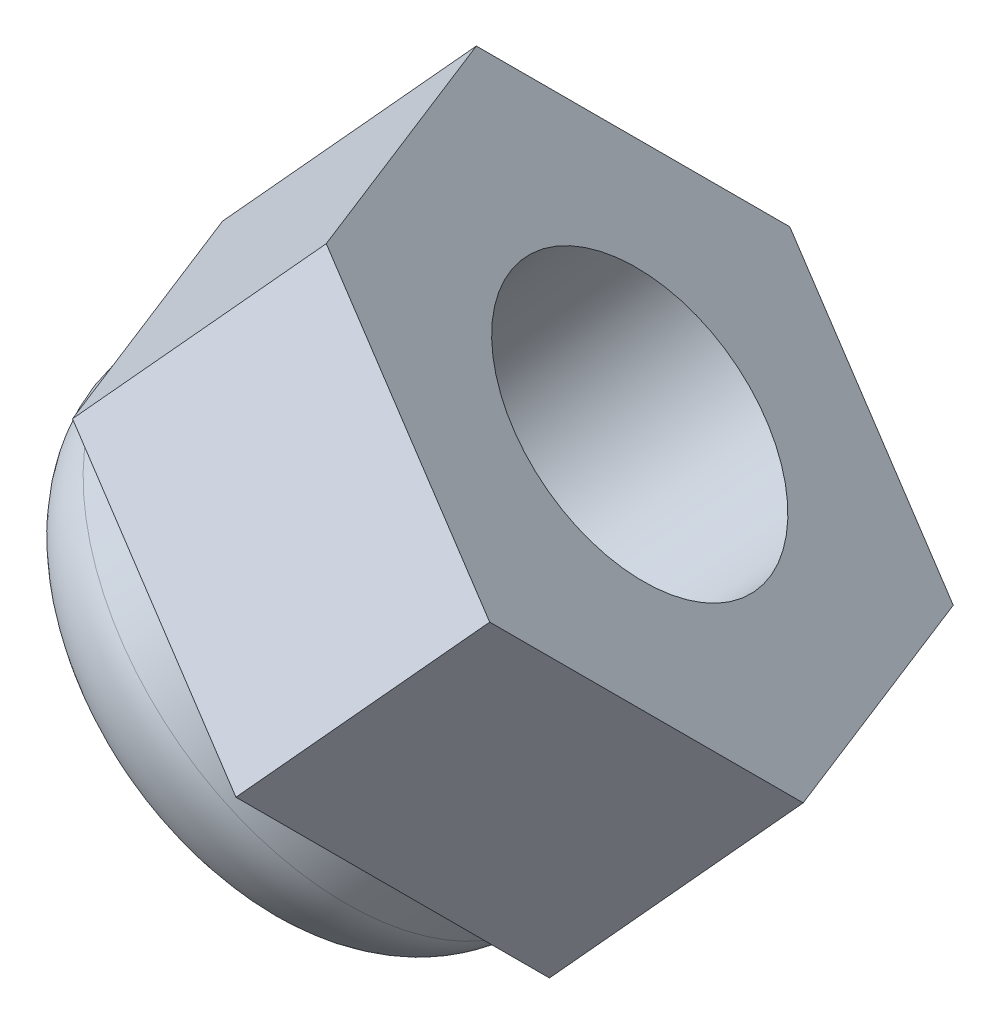
ISO-10303-21;
HEADER;
FILE_DESCRIPTION(('STEP AP214'),'2;1');
FILE_NAME('part.step','',(''),(''),'','','');
FILE_SCHEMA(('AUTOMOTIVE_DESIGN { 1 0 10303 214 1 1 1 1 }'));
ENDSEC;
DATA;
#1=APPLICATION_CONTEXT('core data for automotive mechanical design processes');
#2=APPLICATION_PROTOCOL_DEFINITION('international standard','automotive_design',2000,#1);
#3=PRODUCT_CONTEXT('',#1,'mechanical');
#4=PRODUCT('Part','Part','',(#3));
#5=PRODUCT_RELATED_PRODUCT_CATEGORY('part','',(#4));
#6=PRODUCT_DEFINITION_FORMATION('','',#4);
#7=PRODUCT_DEFINITION_CONTEXT('part definition',#1,'design');
#8=PRODUCT_DEFINITION('design','',#6,#7);
#9=PRODUCT_DEFINITION_SHAPE('','',#8);
#10=(LENGTH_UNIT() NAMED_UNIT(*) SI_UNIT(.MILLI.,.METRE.));
#11=(NAMED_UNIT(*) PLANE_ANGLE_UNIT() SI_UNIT($,.RADIAN.));
#12=(NAMED_UNIT(*) SI_UNIT($,.STERADIAN.) SOLID_ANGLE_UNIT());
#13=UNCERTAINTY_MEASURE_WITH_UNIT(LENGTH_MEASURE(1.E-05),#10,'distance_accuracy_value','');
#14=(GEOMETRIC_REPRESENTATION_CONTEXT(3) GLOBAL_UNCERTAINTY_ASSIGNED_CONTEXT((#13)) GLOBAL_UNIT_ASSIGNED_CONTEXT((#10,
#11,#12)) REPRESENTATION_CONTEXT('',''));
#15=CARTESIAN_POINT('',(0.,0.,0.));
#16=DIRECTION('',(0.,0.,1.));
#17=DIRECTION('',(1.,0.,0.));
#18=AXIS2_PLACEMENT_3D('',#15,#16,#17);
#19=CARTESIAN_POINT('',(7.81654763488652,-44.7743989689793,57.2258527698471));
#20=DIRECTION('',(0.61290058053373,0.707106781184313,-0.352637034902145));
#21=DIRECTION('',(-0.755649570705954,0.654976126505315,0.));
#22=AXIS2_PLACEMENT_3D('',#19,#20,#21);
#23=CYLINDRICAL_SURFACE('',#22,1.49999999999652);
#24=CARTESIAN_POINT('',(10.4213751021575,-41.7691951489429,55.7271453715115));
#25=DIRECTION('',(0.61290058053373,0.707106781184313,-0.352637034902145));
#26=DIRECTION('',(-0.755649570705954,0.654976126505315,0.));
#27=AXIS2_PLACEMENT_3D('',#24,#25,#26);
#28=CIRCLE('',#27,1.49999999999652);
#29=CARTESIAN_POINT('',(9.28790074610121,-40.7867309591872,55.7271453715115));
#30=VERTEX_POINT('',#29);
#31=EDGE_CURVE('E105',#30,#30,#28,.T.);
#32=ORIENTED_EDGE('',*,*,#31,.T.);
#33=EDGE_LOOP('',(#32));
#34=FACE_BOUND('',#33,.T.);
#35=CARTESIAN_POINT('',(7.81654763488652,-44.7743989689793,57.2258527698471));
#36=DIRECTION('',(0.61290058053373,0.707106781184313,-0.352637034902145));
#37=DIRECTION('',(-0.755649570705954,0.654976126505315,0.));
#38=AXIS2_PLACEMENT_3D('',#35,#36,#37);
#39=CIRCLE('',#38,1.49999999999652);
#40=CARTESIAN_POINT('',(6.68307327883022,-43.7919347792236,57.2258527698471));
#41=VERTEX_POINT('',#40);
#42=EDGE_CURVE('E109',#41,#41,#39,.T.);
#43=ORIENTED_EDGE('',*,*,#42,.F.);
#44=EDGE_LOOP('',(#43));
#45=FACE_BOUND('',#44,.T.);
#46=ADVANCED_FACE('F17',(#34,#45),#23,.F.);
#47=CARTESIAN_POINT('',(6.011456576919,-43.22113606169,57.20311374404));
#48=DIRECTION('',(-0.612900580532539,-0.707106781186679,0.352637034899471));
#49=DIRECTION('',(0.378104557586791,-0.654330019279194,-0.654896304312512));
#50=AXIS2_PLACEMENT_3D('',#47,#48,#49);
#51=PLANE('',#50);
#52=ORIENTED_EDGE('',*,*,#42,.T.);
#53=EDGE_LOOP('',(#52));
#54=FACE_BOUND('',#53,.T.);
#55=CARTESIAN_POINT('',(7.81654763488971,-44.7743989689915,57.2258527698307));
#56=DIRECTION('',(0.612900580531282,0.70710678118801,-0.352637034898986));
#57=DIRECTION('',(-0.3781045575874,0.65433001927786,0.654896304313494));
#58=AXIS2_PLACEMENT_3D('',#55,#56,#57);
#59=CIRCLE('',#58,1.60000000000153);
#60=CARTESIAN_POINT('',(8.42151492702986,-45.8213269998347,56.178018682929));
#61=VERTEX_POINT('',#60);
#62=CARTESIAN_POINT('',(7.21158034275055,-43.7274709381431,58.2736868567318));
#63=VERTEX_POINT('',#62);
#64=EDGE_CURVE('E112',#61,#63,#59,.F.);
#65=ORIENTED_EDGE('',*,*,#64,.T.);
#66=CARTESIAN_POINT('',(7.81654763488971,-44.7743989689915,57.2258527698307));
#67=DIRECTION('',(0.612900580531282,0.70710678118801,-0.352637034898986));
#68=DIRECTION('',(0.378104557587544,-0.654330019277914,-0.654896304313357));
#69=AXIS2_PLACEMENT_3D('',#66,#67,#68);
#70=CIRCLE('',#69,1.60000000000153);
#71=EDGE_CURVE('E108',#63,#61,#70,.F.);
#72=ORIENTED_EDGE('',*,*,#71,.T.);
#73=EDGE_LOOP('',(#65,#72));
#74=FACE_BOUND('',#73,.T.);
#75=ADVANCED_FACE('F189',(#54,#74),#51,.T.);
#76=CARTESIAN_POINT('',(7.173389440549,-38.81574595516,56.00423383806));
#77=DIRECTION('',(-0.61290058053355,-0.707106781186272,0.35263703489853));
#78=DIRECTION('',(0.378104557586111,-0.654330019278962,-0.654896304313137));
#79=AXIS2_PLACEMENT_3D('',#76,#77,#78);
#80=PLANE('',#79);
#81=ORIENTED_EDGE('',*,*,#31,.F.);
#82=EDGE_LOOP('',(#81));
#83=FACE_BOUND('',#82,.T.);
#84=DIRECTION('',(-0.78992028962174,0.559305418448253,-0.251402833990253));
#85=VECTOR('',#84,1.);
#86=CARTESIAN_POINT('',(10.4748987801751,-40.5794348969403,58.2058760464043));
#87=LINE('',#86,#85);
#88=CARTESIAN_POINT('',(11.7290656827647,-41.4674515151694,58.6050316545677));
#89=VERTEX_POINT('',#88);
#90=CARTESIAN_POINT('',(9.22073187769769,-39.691418278793,57.8067204382735));
#91=VERTEX_POINT('',#90);
#92=EDGE_CURVE('E147',#89,#91,#87,.T.);
#93=ORIENTED_EDGE('',*,*,#92,.F.);
#94=DIRECTION('',(-0.378104557587663,0.654330019278937,0.654896304312266));
#95=VECTOR('',#94,1.);
#96=CARTESIAN_POINT('',(12.3293872950506,-42.5063399502852,57.5652441212044));
#97=LINE('',#96,#95);
#98=CARTESIAN_POINT('',(12.9297089073393,-43.5452283854007,56.5254565878416));
#99=VERTEX_POINT('',#98);
#100=EDGE_CURVE('E151',#99,#89,#97,.T.);
#101=ORIENTED_EDGE('',*,*,#100,.F.);
#102=DIRECTION('',(0.411815732035274,0.0950246008273509,0.906299138301397));
#103=VECTOR('',#102,1.);
#104=CARTESIAN_POINT('',(12.2758636170356,-43.6961002022853,55.0865134463143));
#105=LINE('',#104,#103);
#106=CARTESIAN_POINT('',(11.6220183266162,-43.8469720190935,53.6475703047494));
#107=VERTEX_POINT('',#106);
#108=EDGE_CURVE('E85',#107,#99,#105,.T.);
#109=ORIENTED_EDGE('',*,*,#108,.F.);
#110=DIRECTION('',(0.789920289620018,-0.55930541845189,0.251402833987573));
#111=VECTOR('',#110,1.);
#112=CARTESIAN_POINT('',(10.3678514241397,-42.9589554009452,53.2484146966194));
#113=LINE('',#112,#111);
#114=CARTESIAN_POINT('',(9.11368452155203,-42.0709387827129,52.8492590884546));
#115=VERTEX_POINT('',#114);
#116=EDGE_CURVE('E81',#115,#107,#113,.T.);
#117=ORIENTED_EDGE('',*,*,#116,.F.);
#118=DIRECTION('',(0.378104557586415,-0.654330019277779,-0.654896304314143));
#119=VECTOR('',#118,1.);
#120=CARTESIAN_POINT('',(8.51336290926466,-41.0320503475954,53.8890466218194));
#121=LINE('',#120,#119);
#122=CARTESIAN_POINT('',(7.91304129697766,-39.9931619124808,54.9288341551821));
#123=VERTEX_POINT('',#122);
#124=EDGE_CURVE('E156',#123,#115,#121,.T.);
#125=ORIENTED_EDGE('',*,*,#124,.F.);
#126=DIRECTION('',(-0.411815732033934,-0.0950246008270996,-0.906299138302032));
#127=VECTOR('',#126,1.);
#128=CARTESIAN_POINT('',(8.56688658728017,-39.8422900955953,56.3677772967094));
#129=LINE('',#128,#127);
#130=EDGE_CURVE('E137',#91,#123,#129,.T.);
#131=ORIENTED_EDGE('',*,*,#130,.F.);
#132=EDGE_LOOP('',(#93,#101,#109,#117,#125,#131));
#133=FACE_BOUND('',#132,.T.);
#134=ADVANCED_FACE('F166',(#83,#133),#80,.F.);
#135=CARTESIAN_POINT('',(8.42944821542099,-44.0672921878035,56.8732157349317));
#136=DIRECTION('',(-0.612900580531282,-0.70710678118801,0.352637034898986));
#137=DIRECTION('',(0.378104557588239,-0.654330019278183,-0.654896304312686));
#138=AXIS2_PLACEMENT_3D('',#135,#136,#137);
#139=TOROIDAL_SURFACE('',#138,1.60000000000219,1.);
#140=ORIENTED_EDGE('',*,*,#64,.F.);
#141=ORIENTED_EDGE('',*,*,#71,.F.);
#142=EDGE_LOOP('',(#140,#141));
#143=FACE_BOUND('',#142,.T.);
#144=CARTESIAN_POINT('',(8.42944821543103,-44.0672921877919,56.873215734926));
#145=DIRECTION('',(-0.612900580536237,-0.70710678118257,0.352637034901283));
#146=DIRECTION('',(0.378104557584169,-0.654330019283159,-0.654896304310064));
#147=AXIS2_PLACEMENT_3D('',#144,#145,#146);
#148=CIRCLE('',#147,2.59999999999843);
#149=CARTESIAN_POINT('',(9.41252006514927,-45.7685502379271,55.1704853437208));
#150=VERTEX_POINT('',#149);
#151=EDGE_CURVE('E101',#150,#150,#148,.T.);
#152=ORIENTED_EDGE('',*,*,#151,.T.);
#153=EDGE_LOOP('',(#152));
#154=FACE_BOUND('',#153,.T.);
#155=ADVANCED_FACE('F161',(#143,#154),#139,.T.);
#156=CARTESIAN_POINT('',(7.922737964415,-39.91271550211,54.9510306196));
#157=DIRECTION('',(-0.693822615598157,0.268052655033845,-0.668399545342334));
#158=DIRECTION('',(0.378104557586418,-0.654330019277778,-0.654896304314143));
#159=AXIS2_PLACEMENT_3D('',#156,#157,#158);
#160=PLANE('',#159);
#161=ORIENTED_EDGE('',*,*,#124,.T.);
#162=DIRECTION('',(0.612900580533941,0.707106781185783,-0.352637034898832));
#163=VECTOR('',#162,1.);
#164=CARTESIAN_POINT('',(8.27094622331854,-43.0432106068442,53.3341350114415));
#165=LINE('',#164,#163);
#166=CARTESIAN_POINT('',(7.42820792508417,-44.0154824309769,53.8190109344259));
#167=VERTEX_POINT('',#166);
#168=EDGE_CURVE('E67',#167,#115,#165,.T.);
#169=ORIENTED_EDGE('',*,*,#168,.F.);
#170=DIRECTION('',(0.378104557586366,-0.654330019278157,-0.654896304313794));
#171=VECTOR('',#170,1.);
#172=CARTESIAN_POINT('',(6.82788631279821,-42.9765939958637,54.8587984677878));
#173=LINE('',#172,#171);
#174=CARTESIAN_POINT('',(6.22756470051156,-41.9377055607489,55.8985860011516));
#175=VERTEX_POINT('',#174);
#176=EDGE_CURVE('E99',#175,#167,#173,.T.);
#177=ORIENTED_EDGE('',*,*,#176,.F.);
#178=DIRECTION('',(-0.612900580532254,-0.707106781187635,0.35263703489805));
#179=VECTOR('',#178,1.);
#180=CARTESIAN_POINT('',(7.07030299874465,-40.9654337366145,55.4137100781663));
#181=LINE('',#180,#179);
#182=EDGE_CURVE('E145',#123,#175,#181,.T.);
#183=ORIENTED_EDGE('',*,*,#182,.F.);
#184=EDGE_LOOP('',(#161,#169,#177,#183));
#185=FACE_BOUND('',#184,.T.);
#186=ADVANCED_FACE('F165',(#185),#160,.T.);
#187=CARTESIAN_POINT('',(9.097227377378,-41.99652724502,52.81389782721));
#188=DIRECTION('',(-0.0194631556437923,-0.432640091636891,-0.901356609051494));
#189=DIRECTION('',(0.789920289620006,-0.559305418451905,0.251402833987577));
#190=AXIS2_PLACEMENT_3D('',#187,#188,#189);
#191=PLANE('',#190);
#192=ORIENTED_EDGE('',*,*,#116,.T.);
#193=DIRECTION('',(0.612900580533232,0.707106781188328,-0.35263703489496));
#194=VECTOR('',#193,1.);
#195=CARTESIAN_POINT('',(10.7792800284991,-44.8192438433045,54.132446227771));
#196=LINE('',#195,#194);
#197=CARTESIAN_POINT('',(9.93654173026565,-45.7915156674354,54.617322150754));
#198=VERTEX_POINT('',#197);
#199=EDGE_CURVE('E73',#198,#107,#196,.T.);
#200=ORIENTED_EDGE('',*,*,#199,.F.);
#201=DIRECTION('',(0.789920289621149,-0.559305418449632,0.251402833989043));
#202=VECTOR('',#201,1.);
#203=CARTESIAN_POINT('',(7.42820792508497,-44.0154824309784,53.8190109344241));
#204=LINE('',#203,#202);
#205=EDGE_CURVE('E77',#167,#198,#204,.T.);
#206=ORIENTED_EDGE('',*,*,#205,.F.);
#207=ORIENTED_EDGE('',*,*,#168,.T.);
#208=EDGE_LOOP('',(#192,#200,#206,#207));
#209=FACE_BOUND('',#208,.T.);
#210=ADVANCED_FACE('F75',(#209),#191,.T.);
#211=CARTESIAN_POINT('',(11.62957404705,-43.81411601888,53.57061754221));
#212=DIRECTION('',(0.674359459955911,-0.70069274666966,-0.232957063710248));
#213=DIRECTION('',(0.411815732035317,0.0950246008272967,0.906299138301383));
#214=AXIS2_PLACEMENT_3D('',#211,#212,#213);
#215=PLANE('',#214);
#216=ORIENTED_EDGE('',*,*,#108,.T.);
#217=DIRECTION('',(0.612900580534812,0.707106781185176,-0.352637034898533));
#218=VECTOR('',#217,1.);
#219=CARTESIAN_POINT('',(12.0869706091035,-44.5175002095304,57.0103325108294));
#220=LINE('',#219,#218);
#221=CARTESIAN_POINT('',(11.2442323108709,-45.4897720336599,57.4952084338147));
#222=VERTEX_POINT('',#221);
#223=EDGE_CURVE('E91',#222,#99,#220,.T.);
#224=ORIENTED_EDGE('',*,*,#223,.F.);
#225=DIRECTION('',(0.411815732034053,0.0950246008286369,0.906299138301817));
#226=VECTOR('',#225,1.);
#227=CARTESIAN_POINT('',(9.93654173026599,-45.7915156674345,54.6173221507564));
#228=LINE('',#227,#226);
#229=EDGE_CURVE('E88',#198,#222,#228,.T.);
#230=ORIENTED_EDGE('',*,*,#229,.F.);
#231=ORIENTED_EDGE('',*,*,#199,.T.);
#232=EDGE_LOOP('',(#216,#224,#230,#231));
#233=FACE_BOUND('',#232,.T.);
#234=ADVANCED_FACE('F89',(#233),#215,.T.);
#235=CARTESIAN_POINT('',(12.98743130376,-43.54789304984,56.46447004959));
#236=DIRECTION('',(0.693822615595917,-0.268052655033759,0.668399545344693));
#237=DIRECTION('',(-0.378104557587688,0.654330019278928,0.65489630431226));
#238=AXIS2_PLACEMENT_3D('',#235,#236,#237);
#239=PLANE('',#238);
#240=ORIENTED_EDGE('',*,*,#100,.T.);
#241=DIRECTION('',(0.612900580534068,0.707106781187747,-0.352637034894672));
#242=VECTOR('',#241,1.);
#243=CARTESIAN_POINT('',(10.8863273845314,-42.4397233393009,59.0899075775534));
#244=LINE('',#243,#242);
#245=CARTESIAN_POINT('',(10.0435890862972,-43.4119951634329,59.5747835005365));
#246=VERTEX_POINT('',#245);
#247=EDGE_CURVE('E150',#246,#89,#244,.T.);
#248=ORIENTED_EDGE('',*,*,#247,.F.);
#249=DIRECTION('',(-0.378104557586967,0.654330019278699,0.654896304312905));
#250=VECTOR('',#249,1.);
#251=CARTESIAN_POINT('',(10.6439106985838,-44.4508835985463,58.5349959671772));
#252=LINE('',#251,#250);
#253=EDGE_CURVE('E95',#222,#246,#252,.T.);
#254=ORIENTED_EDGE('',*,*,#253,.F.);
#255=ORIENTED_EDGE('',*,*,#223,.T.);
#256=EDGE_LOOP('',(#240,#248,#254,#255));
#257=FACE_BOUND('',#256,.T.);
#258=ADVANCED_FACE('F257',(#257),#239,.T.);
#259=CARTESIAN_POINT('',(11.8129418908,-41.46408130693,58.60160284198));
#260=DIRECTION('',(0.0194631556376765,0.432640091635867,0.901356609052117));
#261=DIRECTION('',(-0.789920289621765,0.559305418448193,-0.251402833990308));
#262=AXIS2_PLACEMENT_3D('',#259,#260,#261);
#263=PLANE('',#262);
#264=ORIENTED_EDGE('',*,*,#92,.T.);
#265=DIRECTION('',(0.612900580533712,0.707106781185951,-0.352637034898891));
#266=VECTOR('',#265,1.);
#267=CARTESIAN_POINT('',(8.3779935793494,-40.6636901028405,58.2915963612239));
#268=LINE('',#267,#266);
#269=CARTESIAN_POINT('',(7.53525528111574,-41.6359619269737,58.7764722842085));
#270=VERTEX_POINT('',#269);
#271=EDGE_CURVE('E146',#270,#91,#268,.T.);
#272=ORIENTED_EDGE('',*,*,#271,.F.);
#273=DIRECTION('',(-0.789920289621136,0.559305418449912,-0.251402833988461));
#274=VECTOR('',#273,1.);
#275=CARTESIAN_POINT('',(10.043589086297,-43.4119951634311,59.5747835005384));
#276=LINE('',#275,#274);
#277=EDGE_CURVE('E229',#246,#270,#276,.T.);
#278=ORIENTED_EDGE('',*,*,#277,.F.);
#279=ORIENTED_EDGE('',*,*,#247,.T.);
#280=EDGE_LOOP('',(#264,#272,#278,#279));
#281=FACE_BOUND('',#280,.T.);
#282=ADVANCED_FACE('F240',(#281),#263,.T.);
#283=CARTESIAN_POINT('',(9.280595221124,-39.64649253307,57.84488312698));
#284=DIRECTION('',(-0.674359459954424,0.700692746671719,0.232957063708359));
#285=DIRECTION('',(-0.411815732033937,-0.0950246008270415,-0.906299138302036));
#286=AXIS2_PLACEMENT_3D('',#283,#284,#285);
#287=PLANE('',#286);
#288=ORIENTED_EDGE('',*,*,#130,.T.);
#289=ORIENTED_EDGE('',*,*,#182,.T.);
#290=DIRECTION('',(-0.4118157320341,-0.0950246008285908,-0.9062991383018));
#291=VECTOR('',#290,1.);
#292=CARTESIAN_POINT('',(7.53525528111672,-41.6359619269747,58.7764722842082));
#293=LINE('',#292,#291);
#294=EDGE_CURVE('E236',#270,#175,#293,.T.);
#295=ORIENTED_EDGE('',*,*,#294,.F.);
#296=ORIENTED_EDGE('',*,*,#271,.T.);
#297=EDGE_LOOP('',(#288,#289,#295,#296));
#298=FACE_BOUND('',#297,.T.);
#299=ADVANCED_FACE('F246',(#298),#287,.T.);
#300=CARTESIAN_POINT('',(8.67460844764586,-43.7844494753185,56.7321609209652));
#301=DIRECTION('',(-0.612900580536237,-0.707106781182569,0.352637034901285));
#302=DIRECTION('',(0.755649570703828,-0.654976126507768,0.));
#303=AXIS2_PLACEMENT_3D('',#300,#301,#302);
#304=CYLINDRICAL_SURFACE('',#303,2.59999999999824);
#305=ORIENTED_EDGE('',*,*,#151,.F.);
#306=EDGE_LOOP('',(#305));
#307=FACE_BOUND('',#306,.T.);
#308=CARTESIAN_POINT('',(8.67460844763071,-43.7844494753272,56.7321609209736));
#309=DIRECTION('',(-0.612900580531264,-0.707106781188014,0.352637034899012));
#310=DIRECTION('',(0.378104557588883,-0.654330019278439,-0.654896304312058));
#311=AXIS2_PLACEMENT_3D('',#308,#309,#310);
#312=CIRCLE('',#311,2.60000000000142);
#313=CARTESIAN_POINT('',(9.65768029736234,-45.4857075254521,55.0294305297613));
#314=VERTEX_POINT('',#313);
#315=EDGE_CURVE('E30',#314,#314,#312,.F.);
#316=ORIENTED_EDGE('',*,*,#315,.F.);
#317=EDGE_LOOP('',(#316));
#318=FACE_BOUND('',#317,.T.);
#319=ADVANCED_FACE('F129',(#307,#318),#304,.T.);
#320=CARTESIAN_POINT('',(5.487912844083,-40.76028960343,56.97398568403));
#321=DIRECTION('',(-0.6129005805327,-0.70710678118709,0.352637034898366));
#322=DIRECTION('',(0.378104557586354,-0.654330019278146,-0.654896304313812));
#323=AXIS2_PLACEMENT_3D('',#320,#321,#322);
#324=PLANE('',#323);
#325=CARTESIAN_POINT('',(8.73589850568376,-43.7137387972085,56.6968972174838));
#326=DIRECTION('',(-0.612900580531264,-0.707106781188014,0.352637034899012));
#327=DIRECTION('',(-0.378104557589027,0.654330019278495,0.65489630431192));
#328=AXIS2_PLACEMENT_3D('',#325,#326,#327);
#329=CIRCLE('',#328,2.7000000000015);
#330=CARTESIAN_POINT('',(7.71501620019863,-41.9470477451549,58.4651172391273));
#331=VERTEX_POINT('',#330);
#332=CARTESIAN_POINT('',(9.75678081117461,-45.4804298492593,54.9286771958391));
#333=VERTEX_POINT('',#332);
#334=EDGE_CURVE('E11',#331,#333,#329,.T.);
#335=ORIENTED_EDGE('',*,*,#334,.F.);
#336=CARTESIAN_POINT('',(8.73589850568377,-43.7137387972085,56.6968972174838));
#337=DIRECTION('',(-0.612900580531264,-0.707106781188014,0.352637034899012));
#338=DIRECTION('',(0.378104557588882,-0.654330019278439,-0.654896304312059));
#339=AXIS2_PLACEMENT_3D('',#336,#337,#338);
#340=CIRCLE('',#339,2.7000000000015);
#341=EDGE_CURVE('E37',#331,#333,#340,.F.);
#342=ORIENTED_EDGE('',*,*,#341,.T.);
#343=EDGE_LOOP('',(#335,#342));
#344=FACE_BOUND('',#343,.T.);
#345=ORIENTED_EDGE('',*,*,#277,.T.);
#346=ORIENTED_EDGE('',*,*,#294,.T.);
#347=ORIENTED_EDGE('',*,*,#176,.T.);
#348=ORIENTED_EDGE('',*,*,#205,.T.);
#349=ORIENTED_EDGE('',*,*,#229,.T.);
#350=ORIENTED_EDGE('',*,*,#253,.T.);
#351=EDGE_LOOP('',(#345,#346,#347,#348,#349,#350));
#352=FACE_BOUND('',#351,.T.);
#353=ADVANCED_FACE('F19',(#344,#352),#324,.T.);
#354=CARTESIAN_POINT('',(8.67460844763064,-43.7844494753273,56.7321609209737));
#355=DIRECTION('',(-0.612900580531264,-0.707106781188014,0.352637034899012));
#356=DIRECTION('',(0.378104557588823,-0.654330019278416,-0.654896304312116));
#357=AXIS2_PLACEMENT_3D('',#354,#355,#356);
#358=TOROIDAL_SURFACE('',#357,2.70000000000142,0.1);
#359=ORIENTED_EDGE('',*,*,#315,.T.);
#360=EDGE_LOOP('',(#359));
#361=FACE_BOUND('',#360,.T.);
#362=ORIENTED_EDGE('',*,*,#334,.T.);
#363=ORIENTED_EDGE('',*,*,#341,.F.);
#364=EDGE_LOOP('',(#362,#363));
#365=FACE_BOUND('',#364,.T.);
#366=ADVANCED_FACE('F118',(#361,#365),#358,.F.);
#367=CLOSED_SHELL('',(#46,#75,#134,#155,#186,#210,#234,#258,#282,#299,#319,#353,#366));
#368=MANIFOLD_SOLID_BREP('B1',#367);
#369=ADVANCED_BREP_SHAPE_REPRESENTATION('',(#18,#368),#14);
#370=SHAPE_DEFINITION_REPRESENTATION(#9,#369);
ENDSEC;
END-ISO-10303-21;
